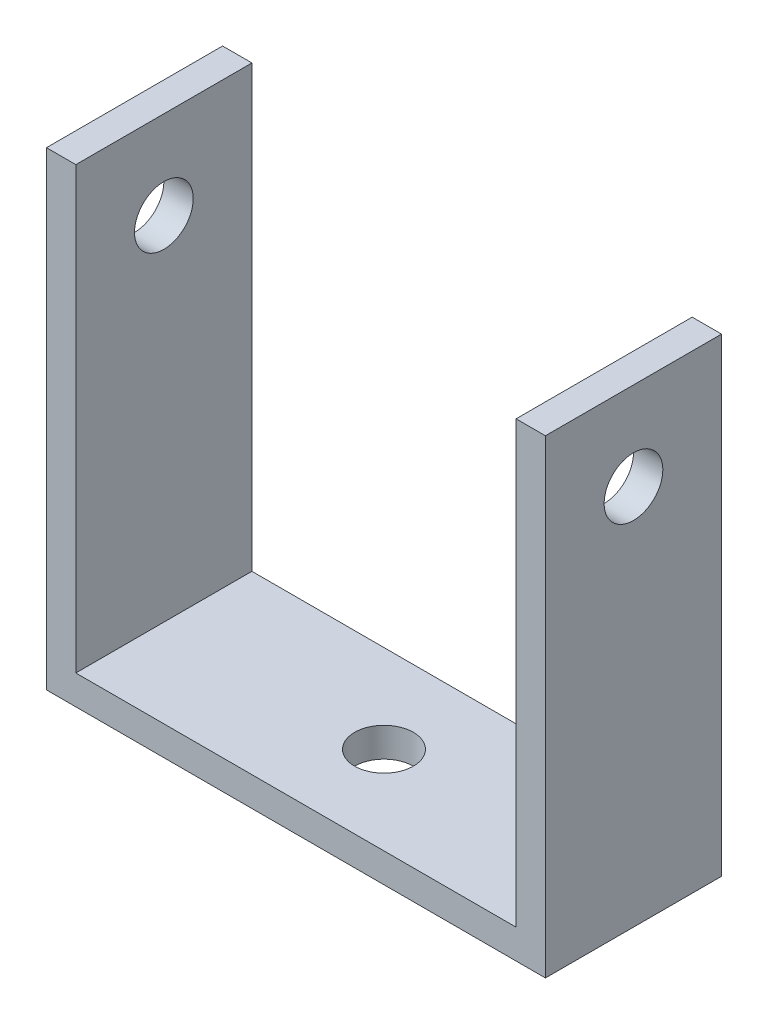
ISO-10303-21;
HEADER;
FILE_DESCRIPTION(('STEP AP214'),'2;1');
FILE_NAME('part.step','',(''),(''),'','','');
FILE_SCHEMA(('AUTOMOTIVE_DESIGN { 1 0 10303 214 1 1 1 1 }'));
ENDSEC;
DATA;
#1=APPLICATION_CONTEXT('core data for automotive mechanical design processes');
#2=APPLICATION_PROTOCOL_DEFINITION('international standard','automotive_design',2000,#1);
#3=PRODUCT_CONTEXT('',#1,'mechanical');
#4=PRODUCT('Part','Part','',(#3));
#5=PRODUCT_RELATED_PRODUCT_CATEGORY('part','',(#4));
#6=PRODUCT_DEFINITION_FORMATION('','',#4);
#7=PRODUCT_DEFINITION_CONTEXT('part definition',#1,'design');
#8=PRODUCT_DEFINITION('design','',#6,#7);
#9=PRODUCT_DEFINITION_SHAPE('','',#8);
#10=(LENGTH_UNIT() NAMED_UNIT(*) SI_UNIT(.MILLI.,.METRE.));
#11=(NAMED_UNIT(*) PLANE_ANGLE_UNIT() SI_UNIT($,.RADIAN.));
#12=(NAMED_UNIT(*) SI_UNIT($,.STERADIAN.) SOLID_ANGLE_UNIT());
#13=UNCERTAINTY_MEASURE_WITH_UNIT(LENGTH_MEASURE(1.E-05),#10,'distance_accuracy_value','');
#14=(GEOMETRIC_REPRESENTATION_CONTEXT(3) GLOBAL_UNCERTAINTY_ASSIGNED_CONTEXT((#13)) GLOBAL_UNIT_ASSIGNED_CONTEXT((#10,
#11,#12)) REPRESENTATION_CONTEXT('',''));
#15=CARTESIAN_POINT('',(0.,0.,0.));
#16=DIRECTION('',(0.,0.,1.));
#17=DIRECTION('',(1.,0.,0.));
#18=AXIS2_PLACEMENT_3D('',#15,#16,#17);
#19=CARTESIAN_POINT('',(-75.,0.,30.));
#20=DIRECTION('',(-1.,0.,0.));
#21=DIRECTION('',(0.,0.,1.));
#22=AXIS2_PLACEMENT_3D('',#19,#20,#21);
#23=PLANE('',#22);
#24=CARTESIAN_POINT('',(-75.,120.,0.));
#25=DIRECTION('',(-1.,0.,0.));
#26=DIRECTION('',(0.,0.,1.));
#27=AXIS2_PLACEMENT_3D('',#24,#25,#26);
#28=CIRCLE('',#27,10.);
#29=CARTESIAN_POINT('',(-75.,120.,10.));
#30=VERTEX_POINT('',#29);
#31=EDGE_CURVE('E145',#30,#30,#28,.T.);
#32=ORIENTED_EDGE('',*,*,#31,.T.);
#33=EDGE_LOOP('',(#32));
#34=FACE_BOUND('',#33,.T.);
#35=DIRECTION('',(0.,1.,0.));
#36=VECTOR('',#35,1.);
#37=CARTESIAN_POINT('',(-75.,0.,-30.));
#38=LINE('',#37,#36);
#39=CARTESIAN_POINT('',(-75.,0.,-30.));
#40=VERTEX_POINT('',#39);
#41=CARTESIAN_POINT('',(-75.,150.,-30.));
#42=VERTEX_POINT('',#41);
#43=EDGE_CURVE('E142',#40,#42,#38,.T.);
#44=ORIENTED_EDGE('',*,*,#43,.T.);
#45=DIRECTION('',(0.,0.,-1.));
#46=VECTOR('',#45,1.);
#47=CARTESIAN_POINT('',(-75.,150.,30.));
#48=LINE('',#47,#46);
#49=CARTESIAN_POINT('',(-75.,150.,30.));
#50=VERTEX_POINT('',#49);
#51=EDGE_CURVE('E49',#50,#42,#48,.T.);
#52=ORIENTED_EDGE('',*,*,#51,.F.);
#53=DIRECTION('',(0.,1.,0.));
#54=VECTOR('',#53,1.);
#55=CARTESIAN_POINT('',(-75.,0.,30.));
#56=LINE('',#55,#54);
#57=CARTESIAN_POINT('',(-75.,0.,30.));
#58=VERTEX_POINT('',#57);
#59=EDGE_CURVE('E102',#58,#50,#56,.T.);
#60=ORIENTED_EDGE('',*,*,#59,.F.);
#61=DIRECTION('',(0.,0.,-1.));
#62=VECTOR('',#61,1.);
#63=CARTESIAN_POINT('',(-75.,0.,30.));
#64=LINE('',#63,#62);
#65=EDGE_CURVE('E11',#58,#40,#64,.T.);
#66=ORIENTED_EDGE('',*,*,#65,.T.);
#67=EDGE_LOOP('',(#44,#52,#60,#66));
#68=FACE_BOUND('',#67,.T.);
#69=ADVANCED_FACE('F40',(#34,#68),#23,.F.);
#70=CARTESIAN_POINT('',(-85.,150.,30.));
#71=DIRECTION('',(0.,-1.,0.));
#72=DIRECTION('',(0.,0.,-1.));
#73=AXIS2_PLACEMENT_3D('',#70,#71,#72);
#74=PLANE('',#73);
#75=DIRECTION('',(-1.,0.,0.));
#76=VECTOR('',#75,1.);
#77=CARTESIAN_POINT('',(-85.,150.,-30.));
#78=LINE('',#77,#76);
#79=CARTESIAN_POINT('',(-85.,150.,-30.));
#80=VERTEX_POINT('',#79);
#81=EDGE_CURVE('E144',#42,#80,#78,.T.);
#82=ORIENTED_EDGE('',*,*,#81,.T.);
#83=DIRECTION('',(0.,0.,-1.));
#84=VECTOR('',#83,1.);
#85=CARTESIAN_POINT('',(-85.,150.,30.));
#86=LINE('',#85,#84);
#87=CARTESIAN_POINT('',(-85.,150.,30.));
#88=VERTEX_POINT('',#87);
#89=EDGE_CURVE('E163',#88,#80,#86,.T.);
#90=ORIENTED_EDGE('',*,*,#89,.F.);
#91=DIRECTION('',(-1.,0.,0.));
#92=VECTOR('',#91,1.);
#93=CARTESIAN_POINT('',(-85.,150.,30.));
#94=LINE('',#93,#92);
#95=EDGE_CURVE('E187',#50,#88,#94,.T.);
#96=ORIENTED_EDGE('',*,*,#95,.F.);
#97=ORIENTED_EDGE('',*,*,#51,.T.);
#98=EDGE_LOOP('',(#82,#90,#96,#97));
#99=FACE_BOUND('',#98,.T.);
#100=ADVANCED_FACE('F207',(#99),#74,.F.);
#101=CARTESIAN_POINT('',(-85.,-10.,30.));
#102=DIRECTION('',(1.,0.,0.));
#103=DIRECTION('',(0.,0.,-1.));
#104=AXIS2_PLACEMENT_3D('',#101,#102,#103);
#105=PLANE('',#104);
#106=CARTESIAN_POINT('',(-85.,120.,0.));
#107=DIRECTION('',(1.,0.,0.));
#108=DIRECTION('',(0.,0.,-1.));
#109=AXIS2_PLACEMENT_3D('',#106,#107,#108);
#110=CIRCLE('',#109,10.);
#111=CARTESIAN_POINT('',(-85.,120.,-10.));
#112=VERTEX_POINT('',#111);
#113=EDGE_CURVE('E170',#112,#112,#110,.T.);
#114=ORIENTED_EDGE('',*,*,#113,.T.);
#115=EDGE_LOOP('',(#114));
#116=FACE_BOUND('',#115,.T.);
#117=DIRECTION('',(0.,-1.,0.));
#118=VECTOR('',#117,1.);
#119=CARTESIAN_POINT('',(-85.,-10.,-30.));
#120=LINE('',#119,#118);
#121=CARTESIAN_POINT('',(-85.,-10.,-30.));
#122=VERTEX_POINT('',#121);
#123=EDGE_CURVE('E147',#80,#122,#120,.T.);
#124=ORIENTED_EDGE('',*,*,#123,.T.);
#125=DIRECTION('',(0.,0.,-1.));
#126=VECTOR('',#125,1.);
#127=CARTESIAN_POINT('',(-85.,-10.,30.));
#128=LINE('',#127,#126);
#129=CARTESIAN_POINT('',(-85.,-10.,30.));
#130=VERTEX_POINT('',#129);
#131=EDGE_CURVE('E160',#130,#122,#128,.T.);
#132=ORIENTED_EDGE('',*,*,#131,.F.);
#133=DIRECTION('',(0.,-1.,0.));
#134=VECTOR('',#133,1.);
#135=CARTESIAN_POINT('',(-85.,-10.,30.));
#136=LINE('',#135,#134);
#137=EDGE_CURVE('E189',#88,#130,#136,.T.);
#138=ORIENTED_EDGE('',*,*,#137,.F.);
#139=ORIENTED_EDGE('',*,*,#89,.T.);
#140=EDGE_LOOP('',(#124,#132,#138,#139));
#141=FACE_BOUND('',#140,.T.);
#142=ADVANCED_FACE('F195',(#116,#141),#105,.F.);
#143=CARTESIAN_POINT('',(0.,-10.,30.));
#144=DIRECTION('',(0.,1.,0.));
#145=DIRECTION('',(0.,0.,1.));
#146=AXIS2_PLACEMENT_3D('',#143,#144,#145);
#147=PLANE('',#146);
#148=CARTESIAN_POINT('',(0.,-10.,0.));
#149=DIRECTION('',(0.,1.,0.));
#150=DIRECTION('',(0.,0.,1.));
#151=AXIS2_PLACEMENT_3D('',#148,#149,#150);
#152=CIRCLE('',#151,10.);
#153=CARTESIAN_POINT('',(0.,-10.,10.));
#154=VERTEX_POINT('',#153);
#155=EDGE_CURVE('E176',#154,#154,#152,.T.);
#156=ORIENTED_EDGE('',*,*,#155,.T.);
#157=EDGE_LOOP('',(#156));
#158=FACE_BOUND('',#157,.T.);
#159=DIRECTION('',(1.,0.,0.));
#160=VECTOR('',#159,1.);
#161=CARTESIAN_POINT('',(0.,-10.,-30.));
#162=LINE('',#161,#160);
#163=CARTESIAN_POINT('',(85.,-10.,-30.));
#164=VERTEX_POINT('',#163);
#165=EDGE_CURVE('E150',#122,#164,#162,.T.);
#166=ORIENTED_EDGE('',*,*,#165,.T.);
#167=DIRECTION('',(0.,0.,-1.));
#168=VECTOR('',#167,1.);
#169=CARTESIAN_POINT('',(85.,-10.,30.));
#170=LINE('',#169,#168);
#171=CARTESIAN_POINT('',(85.,-10.,30.));
#172=VERTEX_POINT('',#171);
#173=EDGE_CURVE('E131',#172,#164,#170,.T.);
#174=ORIENTED_EDGE('',*,*,#173,.F.);
#175=DIRECTION('',(1.,0.,0.));
#176=VECTOR('',#175,1.);
#177=CARTESIAN_POINT('',(0.,-10.,30.));
#178=LINE('',#177,#176);
#179=EDGE_CURVE('E122',#130,#172,#178,.T.);
#180=ORIENTED_EDGE('',*,*,#179,.F.);
#181=ORIENTED_EDGE('',*,*,#131,.T.);
#182=EDGE_LOOP('',(#166,#174,#180,#181));
#183=FACE_BOUND('',#182,.T.);
#184=ADVANCED_FACE('F198',(#158,#183),#147,.F.);
#185=CARTESIAN_POINT('',(85.,-10.,30.));
#186=DIRECTION('',(-1.,0.,0.));
#187=DIRECTION('',(0.,0.,1.));
#188=AXIS2_PLACEMENT_3D('',#185,#186,#187);
#189=PLANE('',#188);
#190=CARTESIAN_POINT('',(85.,120.,0.));
#191=DIRECTION('',(-1.,0.,0.));
#192=DIRECTION('',(0.,0.,1.));
#193=AXIS2_PLACEMENT_3D('',#190,#191,#192);
#194=CIRCLE('',#193,10.);
#195=CARTESIAN_POINT('',(85.,120.,10.));
#196=VERTEX_POINT('',#195);
#197=EDGE_CURVE('E169',#196,#196,#194,.T.);
#198=ORIENTED_EDGE('',*,*,#197,.T.);
#199=EDGE_LOOP('',(#198));
#200=FACE_BOUND('',#199,.T.);
#201=DIRECTION('',(0.,1.,0.));
#202=VECTOR('',#201,1.);
#203=CARTESIAN_POINT('',(85.,-10.,-30.));
#204=LINE('',#203,#202);
#205=CARTESIAN_POINT('',(85.,150.,-30.));
#206=VERTEX_POINT('',#205);
#207=EDGE_CURVE('E130',#164,#206,#204,.T.);
#208=ORIENTED_EDGE('',*,*,#207,.T.);
#209=DIRECTION('',(0.,0.,-1.));
#210=VECTOR('',#209,1.);
#211=CARTESIAN_POINT('',(85.,150.,30.));
#212=LINE('',#211,#210);
#213=CARTESIAN_POINT('',(85.,150.,30.));
#214=VERTEX_POINT('',#213);
#215=EDGE_CURVE('E127',#214,#206,#212,.T.);
#216=ORIENTED_EDGE('',*,*,#215,.F.);
#217=DIRECTION('',(0.,1.,0.));
#218=VECTOR('',#217,1.);
#219=CARTESIAN_POINT('',(85.,-10.,30.));
#220=LINE('',#219,#218);
#221=EDGE_CURVE('E116',#172,#214,#220,.T.);
#222=ORIENTED_EDGE('',*,*,#221,.F.);
#223=ORIENTED_EDGE('',*,*,#173,.T.);
#224=EDGE_LOOP('',(#208,#216,#222,#223));
#225=FACE_BOUND('',#224,.T.);
#226=ADVANCED_FACE('F128',(#200,#225),#189,.F.);
#227=CARTESIAN_POINT('',(75.,150.,30.));
#228=DIRECTION('',(0.,-1.,0.));
#229=DIRECTION('',(0.,0.,-1.));
#230=AXIS2_PLACEMENT_3D('',#227,#228,#229);
#231=PLANE('',#230);
#232=DIRECTION('',(-1.,0.,0.));
#233=VECTOR('',#232,1.);
#234=CARTESIAN_POINT('',(75.,150.,-30.));
#235=LINE('',#234,#233);
#236=CARTESIAN_POINT('',(75.,150.,-30.));
#237=VERTEX_POINT('',#236);
#238=EDGE_CURVE('E88',#206,#237,#235,.T.);
#239=ORIENTED_EDGE('',*,*,#238,.T.);
#240=DIRECTION('',(0.,0.,-1.));
#241=VECTOR('',#240,1.);
#242=CARTESIAN_POINT('',(75.,150.,30.));
#243=LINE('',#242,#241);
#244=CARTESIAN_POINT('',(75.,150.,30.));
#245=VERTEX_POINT('',#244);
#246=EDGE_CURVE('E132',#245,#237,#243,.T.);
#247=ORIENTED_EDGE('',*,*,#246,.F.);
#248=DIRECTION('',(-1.,0.,0.));
#249=VECTOR('',#248,1.);
#250=CARTESIAN_POINT('',(75.,150.,30.));
#251=LINE('',#250,#249);
#252=EDGE_CURVE('E120',#214,#245,#251,.T.);
#253=ORIENTED_EDGE('',*,*,#252,.F.);
#254=ORIENTED_EDGE('',*,*,#215,.T.);
#255=EDGE_LOOP('',(#239,#247,#253,#254));
#256=FACE_BOUND('',#255,.T.);
#257=ADVANCED_FACE('F134',(#256),#231,.F.);
#258=CARTESIAN_POINT('',(75.,0.,30.));
#259=DIRECTION('',(1.,0.,0.));
#260=DIRECTION('',(0.,0.,-1.));
#261=AXIS2_PLACEMENT_3D('',#258,#259,#260);
#262=PLANE('',#261);
#263=CARTESIAN_POINT('',(75.,120.,0.));
#264=DIRECTION('',(1.,0.,0.));
#265=DIRECTION('',(0.,0.,-1.));
#266=AXIS2_PLACEMENT_3D('',#263,#264,#265);
#267=CIRCLE('',#266,10.);
#268=CARTESIAN_POINT('',(75.,120.,-10.));
#269=VERTEX_POINT('',#268);
#270=EDGE_CURVE('E167',#269,#269,#267,.T.);
#271=ORIENTED_EDGE('',*,*,#270,.T.);
#272=EDGE_LOOP('',(#271));
#273=FACE_BOUND('',#272,.T.);
#274=DIRECTION('',(0.,-1.,0.));
#275=VECTOR('',#274,1.);
#276=CARTESIAN_POINT('',(75.,0.,-30.));
#277=LINE('',#276,#275);
#278=CARTESIAN_POINT('',(75.,0.,-30.));
#279=VERTEX_POINT('',#278);
#280=EDGE_CURVE('E95',#237,#279,#277,.T.);
#281=ORIENTED_EDGE('',*,*,#280,.T.);
#282=DIRECTION('',(0.,0.,-1.));
#283=VECTOR('',#282,1.);
#284=CARTESIAN_POINT('',(75.,0.,30.));
#285=LINE('',#284,#283);
#286=CARTESIAN_POINT('',(75.,0.,30.));
#287=VERTEX_POINT('',#286);
#288=EDGE_CURVE('E138',#287,#279,#285,.T.);
#289=ORIENTED_EDGE('',*,*,#288,.F.);
#290=DIRECTION('',(0.,-1.,0.));
#291=VECTOR('',#290,1.);
#292=CARTESIAN_POINT('',(75.,0.,30.));
#293=LINE('',#292,#291);
#294=EDGE_CURVE('E136',#245,#287,#293,.T.);
#295=ORIENTED_EDGE('',*,*,#294,.F.);
#296=ORIENTED_EDGE('',*,*,#246,.T.);
#297=EDGE_LOOP('',(#281,#289,#295,#296));
#298=FACE_BOUND('',#297,.T.);
#299=ADVANCED_FACE('F205',(#273,#298),#262,.F.);
#300=CARTESIAN_POINT('',(0.,0.,30.));
#301=DIRECTION('',(0.,-1.,0.));
#302=DIRECTION('',(0.,0.,-1.));
#303=AXIS2_PLACEMENT_3D('',#300,#301,#302);
#304=PLANE('',#303);
#305=CARTESIAN_POINT('',(0.,0.,0.));
#306=DIRECTION('',(0.,-1.,0.));
#307=DIRECTION('',(0.,0.,-1.));
#308=AXIS2_PLACEMENT_3D('',#305,#306,#307);
#309=CIRCLE('',#308,10.);
#310=CARTESIAN_POINT('',(0.,0.,-10.));
#311=VERTEX_POINT('',#310);
#312=EDGE_CURVE('E43',#311,#311,#309,.T.);
#313=ORIENTED_EDGE('',*,*,#312,.T.);
#314=EDGE_LOOP('',(#313));
#315=FACE_BOUND('',#314,.T.);
#316=DIRECTION('',(-1.,0.,0.));
#317=VECTOR('',#316,1.);
#318=CARTESIAN_POINT('',(0.,0.,-30.));
#319=LINE('',#318,#317);
#320=EDGE_CURVE('E155',#279,#40,#319,.T.);
#321=ORIENTED_EDGE('',*,*,#320,.T.);
#322=ORIENTED_EDGE('',*,*,#65,.F.);
#323=DIRECTION('',(-1.,0.,0.));
#324=VECTOR('',#323,1.);
#325=CARTESIAN_POINT('',(0.,0.,30.));
#326=LINE('',#325,#324);
#327=EDGE_CURVE('E58',#287,#58,#326,.T.);
#328=ORIENTED_EDGE('',*,*,#327,.F.);
#329=ORIENTED_EDGE('',*,*,#288,.T.);
#330=EDGE_LOOP('',(#321,#322,#328,#329));
#331=FACE_BOUND('',#330,.T.);
#332=ADVANCED_FACE('F204',(#315,#331),#304,.F.);
#333=CARTESIAN_POINT('',(0.,0.,30.));
#334=DIRECTION('',(0.,0.,-1.));
#335=DIRECTION('',(-1.,0.,0.));
#336=AXIS2_PLACEMENT_3D('',#333,#334,#335);
#337=PLANE('',#336);
#338=ORIENTED_EDGE('',*,*,#327,.T.);
#339=ORIENTED_EDGE('',*,*,#59,.T.);
#340=ORIENTED_EDGE('',*,*,#95,.T.);
#341=ORIENTED_EDGE('',*,*,#137,.T.);
#342=ORIENTED_EDGE('',*,*,#179,.T.);
#343=ORIENTED_EDGE('',*,*,#221,.T.);
#344=ORIENTED_EDGE('',*,*,#252,.T.);
#345=ORIENTED_EDGE('',*,*,#294,.T.);
#346=EDGE_LOOP('',(#338,#339,#340,#341,#342,#343,#344,#345));
#347=FACE_BOUND('',#346,.T.);
#348=ADVANCED_FACE('F118',(#347),#337,.F.);
#349=CARTESIAN_POINT('',(0.,0.,-30.));
#350=DIRECTION('',(0.,0.,-1.));
#351=DIRECTION('',(-1.,0.,0.));
#352=AXIS2_PLACEMENT_3D('',#349,#350,#351);
#353=PLANE('',#352);
#354=ORIENTED_EDGE('',*,*,#43,.F.);
#355=ORIENTED_EDGE('',*,*,#320,.F.);
#356=ORIENTED_EDGE('',*,*,#280,.F.);
#357=ORIENTED_EDGE('',*,*,#238,.F.);
#358=ORIENTED_EDGE('',*,*,#207,.F.);
#359=ORIENTED_EDGE('',*,*,#165,.F.);
#360=ORIENTED_EDGE('',*,*,#123,.F.);
#361=ORIENTED_EDGE('',*,*,#81,.F.);
#362=EDGE_LOOP('',(#354,#355,#356,#357,#358,#359,#360,#361));
#363=FACE_BOUND('',#362,.T.);
#364=ADVANCED_FACE('F201',(#363),#353,.T.);
#365=CARTESIAN_POINT('',(-85.,120.,0.));
#366=DIRECTION('',(1.,0.,0.));
#367=DIRECTION('',(0.,0.,-1.));
#368=AXIS2_PLACEMENT_3D('',#365,#366,#367);
#369=CYLINDRICAL_SURFACE('',#368,10.);
#370=ORIENTED_EDGE('',*,*,#270,.F.);
#371=EDGE_LOOP('',(#370));
#372=FACE_BOUND('',#371,.T.);
#373=ORIENTED_EDGE('',*,*,#197,.F.);
#374=EDGE_LOOP('',(#373));
#375=FACE_BOUND('',#374,.T.);
#376=ADVANCED_FACE('F231',(#372,#375),#369,.F.);
#377=ORIENTED_EDGE('',*,*,#113,.F.);
#378=EDGE_LOOP('',(#377));
#379=FACE_BOUND('',#378,.T.);
#380=ORIENTED_EDGE('',*,*,#31,.F.);
#381=EDGE_LOOP('',(#380));
#382=FACE_BOUND('',#381,.T.);
#383=ADVANCED_FACE('F234',(#379,#382),#369,.F.);
#384=CARTESIAN_POINT('',(0.,150.,0.));
#385=DIRECTION('',(0.,-1.,0.));
#386=DIRECTION('',(0.,0.,-1.));
#387=AXIS2_PLACEMENT_3D('',#384,#385,#386);
#388=CYLINDRICAL_SURFACE('',#387,10.);
#389=ORIENTED_EDGE('',*,*,#312,.F.);
#390=EDGE_LOOP('',(#389));
#391=FACE_BOUND('',#390,.T.);
#392=ORIENTED_EDGE('',*,*,#155,.F.);
#393=EDGE_LOOP('',(#392));
#394=FACE_BOUND('',#393,.T.);
#395=ADVANCED_FACE('F237',(#391,#394),#388,.F.);
#396=CLOSED_SHELL('',(#69,#100,#142,#184,#226,#257,#299,#332,#348,#364,#376,#383,#395));
#397=MANIFOLD_SOLID_BREP('B2',#396);
#398=ADVANCED_BREP_SHAPE_REPRESENTATION('',(#18,#397),#14);
#399=SHAPE_DEFINITION_REPRESENTATION(#9,#398);
ENDSEC;
END-ISO-10303-21;
